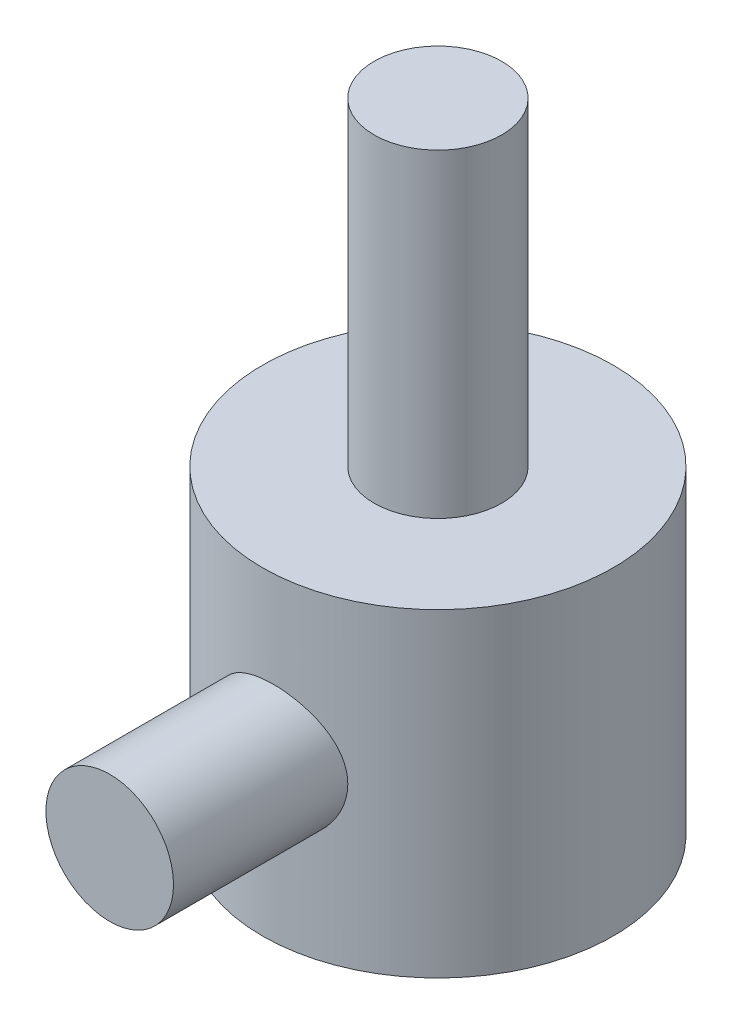
ISO-10303-21;
HEADER;
FILE_DESCRIPTION(('STEP AP214'),'2;1');
FILE_NAME('part.step','',(''),(''),'','','');
FILE_SCHEMA(('AUTOMOTIVE_DESIGN { 1 0 10303 214 1 1 1 1 }'));
ENDSEC;
DATA;
#1=APPLICATION_CONTEXT('core data for automotive mechanical design processes');
#2=APPLICATION_PROTOCOL_DEFINITION('international standard','automotive_design',2000,#1);
#3=PRODUCT_CONTEXT('',#1,'mechanical');
#4=PRODUCT('Part','Part','',(#3));
#5=PRODUCT_RELATED_PRODUCT_CATEGORY('part','',(#4));
#6=PRODUCT_DEFINITION_FORMATION('','',#4);
#7=PRODUCT_DEFINITION_CONTEXT('part definition',#1,'design');
#8=PRODUCT_DEFINITION('design','',#6,#7);
#9=PRODUCT_DEFINITION_SHAPE('','',#8);
#10=(LENGTH_UNIT() NAMED_UNIT(*) SI_UNIT(.MILLI.,.METRE.));
#11=(NAMED_UNIT(*) PLANE_ANGLE_UNIT() SI_UNIT($,.RADIAN.));
#12=(NAMED_UNIT(*) SI_UNIT($,.STERADIAN.) SOLID_ANGLE_UNIT());
#13=UNCERTAINTY_MEASURE_WITH_UNIT(LENGTH_MEASURE(1.E-05),#10,'distance_accuracy_value','');
#14=(GEOMETRIC_REPRESENTATION_CONTEXT(3) GLOBAL_UNCERTAINTY_ASSIGNED_CONTEXT((#13)) GLOBAL_UNIT_ASSIGNED_CONTEXT((#10,
#11,#12)) REPRESENTATION_CONTEXT('',''));
#15=CARTESIAN_POINT('',(0.,0.,0.));
#16=DIRECTION('',(0.,0.,1.));
#17=DIRECTION('',(1.,0.,0.));
#18=AXIS2_PLACEMENT_3D('',#15,#16,#17);
#19=CARTESIAN_POINT('',(0.,100.,0.));
#20=DIRECTION('',(0.,-1.,0.));
#21=DIRECTION('',(0.,0.,-1.));
#22=AXIS2_PLACEMENT_3D('',#19,#20,#21);
#23=CYLINDRICAL_SURFACE('',#22,55.);
#24=CARTESIAN_POINT('',(22.1157216143475,50.,50.3576693014746));
#25=CARTESIAN_POINT('',(22.1157236838797,49.4642124105563,50.3576674020005));
#26=CARTESIAN_POINT('',(22.0941726422844,48.9284527153607,50.3671492687955));
#27=CARTESIAN_POINT('',(22.0082229835859,47.8610714714432,50.4047649735963));
#28=CARTESIAN_POINT('',(21.9438272089872,47.3294496505638,50.4328975742316));
#29=CARTESIAN_POINT('',(21.7729003042168,46.2742760452371,50.5069247732102));
#30=CARTESIAN_POINT('',(21.6663673401147,45.7507246130665,50.552820144638));
#31=CARTESIAN_POINT('',(21.4122807529056,44.7154055414696,50.660963889444));
#32=CARTESIAN_POINT('',(21.2647260590152,44.2036382100193,50.7232126896908));
#33=CARTESIAN_POINT('',(20.93049383175,43.1966926019933,50.8620392855023));
#34=CARTESIAN_POINT('',(20.7439272920014,42.7014717877527,50.9385763642552));
#35=CARTESIAN_POINT('',(20.3330473412654,41.729108970846,51.1039743436858));
#36=CARTESIAN_POINT('',(20.1087342177927,41.2519668305092,51.1928351504931));
#37=CARTESIAN_POINT('',(19.6240888093337,40.3183822663139,51.3805667356155));
#38=CARTESIAN_POINT('',(19.3637544222514,39.8619410525668,51.4794380980269));
#39=CARTESIAN_POINT('',(18.808783755485,38.9719994721132,51.6847869466886));
#40=CARTESIAN_POINT('',(18.5141350050662,38.538507529546,51.7912671927391));
#41=CARTESIAN_POINT('',(17.8765801758587,37.6753213287226,52.0148796726526));
#42=CARTESIAN_POINT('',(17.5319799671762,37.2469466508307,52.1322782096817));
#43=CARTESIAN_POINT('',(16.8091288954211,36.4204113355761,52.3698186213808));
#44=CARTESIAN_POINT('',(16.4308769569539,36.0222516645361,52.48996058363));
#45=CARTESIAN_POINT('',(15.6427420098901,35.2581861832578,52.7302036742049));
#46=CARTESIAN_POINT('',(15.2328454949134,34.8922942897263,52.8503047628728));
#47=CARTESIAN_POINT('',(14.3839889867242,34.1952177650543,53.087616282059));
#48=CARTESIAN_POINT('',(13.9450386490618,33.8640216969062,53.2048276553287));
#49=CARTESIAN_POINT('',(13.0191272960243,33.2236101059816,53.4391324526118));
#50=CARTESIAN_POINT('',(12.5308800438819,32.9161544040873,53.5559624351806));
#51=CARTESIAN_POINT('',(11.5280579103023,32.3438045350466,53.7807391375584));
#52=CARTESIAN_POINT('',(11.0134820421372,32.0789119645983,53.8886855240372));
#53=CARTESIAN_POINT('',(9.96149221299141,31.5940434426413,54.093027998386));
#54=CARTESIAN_POINT('',(9.4240830587943,31.3740580934693,54.1894265011152));
#55=CARTESIAN_POINT('',(8.33010813566391,30.9810845225561,54.3683401258764));
#56=CARTESIAN_POINT('',(7.77354338400982,30.8080938094385,54.4508559837955));
#57=CARTESIAN_POINT('',(6.66655292784668,30.5165409313966,54.5972254774214));
#58=CARTESIAN_POINT('',(6.11667688237308,30.3961842245254,54.6616619272911));
#59=CARTESIAN_POINT('',(5.00711905138647,30.2020965973656,54.7744434677143));
#60=CARTESIAN_POINT('',(4.44743746627115,30.1283647253363,54.8227888867203));
#61=CARTESIAN_POINT('',(3.32281812503466,30.0284826995082,54.9024275776111));
#62=CARTESIAN_POINT('',(2.75788214019345,30.0023170563872,54.9337263981723));
#63=CARTESIAN_POINT('',(1.62713574394996,29.9979777593481,54.9788371155571));
#64=CARTESIAN_POINT('',(1.0613253688053,30.0198021661411,54.9926497189671));
#65=CARTESIAN_POINT('',(-0.0348315937860203,30.1087882222019,55.0025651929048));
#66=CARTESIAN_POINT('',(-0.565384191540226,30.1733330273857,54.9996197106104));
#67=CARTESIAN_POINT('',(-1.61931339885798,30.3446060209454,54.9786831333617));
#68=CARTESIAN_POINT('',(-2.14269031548288,30.4513323984238,54.9606926842662));
#69=CARTESIAN_POINT('',(-3.17858132938641,30.7060925253914,54.9105231469778));
#70=CARTESIAN_POINT('',(-3.69109546826779,30.8541261166498,54.8783441131352));
#71=CARTESIAN_POINT('',(-4.70178901119587,31.1902899737653,54.8010043993189));
#72=CARTESIAN_POINT('',(-5.19996814533689,31.3784209940343,54.7558434750922));
#73=CARTESIAN_POINT('',(-6.179646619676,31.7936701689634,54.6539566742744));
#74=CARTESIAN_POINT('',(-6.66111380062976,32.0208589714683,54.5972098054725));
#75=CARTESIAN_POINT('',(-7.60343400585102,32.5122788100242,54.4739718873885));
#76=CARTESIAN_POINT('',(-8.06428713300254,32.7765096611722,54.407480886746));
#77=CARTESIAN_POINT('',(-8.96276913849415,33.3402171938171,54.2667081134858));
#78=CARTESIAN_POINT('',(-9.40039345308663,33.6397007644732,54.1924248183917));
#79=CARTESIAN_POINT('',(-10.2498808957884,34.2719280467464,54.0381933911985));
#80=CARTESIAN_POINT('',(-10.661742374429,34.6046738844481,53.958244897082));
#81=CARTESIAN_POINT('',(-11.4770259531445,35.3185473823067,53.7908865971499));
#82=CARTESIAN_POINT('',(-11.8790339596309,35.7012505788777,53.7033032372411));
#83=CARTESIAN_POINT('',(-12.6497616572723,36.4985936383672,53.5270011808123));
#84=CARTESIAN_POINT('',(-13.0184803110986,36.9132344957488,53.4382824490113));
#85=CARTESIAN_POINT('',(-13.7204363118421,37.7720107024972,53.2623751771372));
#86=CARTESIAN_POINT('',(-14.0536654126768,38.2161528678085,53.1751869966047));
#87=CARTESIAN_POINT('',(-14.682376356784,39.131144580473,53.0050366961945));
#88=CARTESIAN_POINT('',(-14.9778594104655,39.6019932707239,52.9220744408547));
#89=CARTESIAN_POINT('',(-15.5359570751637,40.5796536150053,52.7609755598733));
#90=CARTESIAN_POINT('',(-15.7975623754953,41.0870708225954,52.6830119769948));
#91=CARTESIAN_POINT('',(-16.276899739838,42.1236100384359,52.5368952650308));
#92=CARTESIAN_POINT('',(-16.4946308581228,42.6527325142566,52.4687423474274));
#93=CARTESIAN_POINT('',(-16.8842668222693,43.7288146829171,52.3446594178914));
#94=CARTESIAN_POINT('',(-17.0561856507013,44.2757688759254,52.2887256774315));
#95=CARTESIAN_POINT('',(-17.3526546848794,45.3836080250294,52.191089151942));
#96=CARTESIAN_POINT('',(-17.4772071551389,45.9444923137822,52.1493856865945));
#97=CARTESIAN_POINT('',(-17.6738350478183,47.0540558401939,52.0830672686161));
#98=CARTESIAN_POINT('',(-17.7477444543932,47.6023748750782,52.0578567941032));
#99=CARTESIAN_POINT('',(-17.8498873953517,48.703741207238,52.0229224435107));
#100=CARTESIAN_POINT('',(-17.8781220570073,49.2567883874823,52.0131981852249));
#101=CARTESIAN_POINT('',(-17.888630231753,50.3632703620991,52.0095850438134));
#102=CARTESIAN_POINT('',(-17.8709119024354,50.9167050702408,52.0156933500848));
#103=CARTESIAN_POINT('',(-17.7897107703952,52.0198027381404,52.0435205169274));
#104=CARTESIAN_POINT('',(-17.7262286926641,52.5694657575103,52.0652391301994));
#105=CARTESIAN_POINT('',(-17.5572736087638,53.64096757415,52.1224495879569));
#106=CARTESIAN_POINT('',(-17.4534147827819,54.1630904727057,52.1574107837548));
#107=CARTESIAN_POINT('',(-17.2047191902253,55.1964386325998,52.2399730413166));
#108=CARTESIAN_POINT('',(-17.059883611254,55.7076642093067,52.2875737367554));
#109=CARTESIAN_POINT('',(-16.7304138133418,56.7159921648381,52.3939231953608));
#110=CARTESIAN_POINT('',(-16.5457743399442,57.2130926692164,52.4526734302399));
#111=CARTESIAN_POINT('',(-16.138126823531,58.1900676691349,52.579524512764));
#112=CARTESIAN_POINT('',(-15.9151175523448,58.6699416126794,52.6476256597062));
#113=CARTESIAN_POINT('',(-15.4253734802736,59.6231642770292,52.7932282472047));
#114=CARTESIAN_POINT('',(-15.157566586028,60.0959295072615,52.8709435348481));
#115=CARTESIAN_POINT('',(-14.5848726163191,61.0174622752617,53.0317821632953));
#116=CARTESIAN_POINT('',(-14.2799850164188,61.4662294734933,53.1149055805791));
#117=CARTESIAN_POINT('',(-13.6349971961724,62.3372856317674,53.2841252800937));
#118=CARTESIAN_POINT('',(-13.2948879317643,62.7595677461716,53.3702223220772));
#119=CARTESIAN_POINT('',(-12.5815713443992,63.5750901547493,53.5428678743474));
#120=CARTESIAN_POINT('',(-12.2083633928435,63.9683298971,53.6294163931791));
#121=CARTESIAN_POINT('',(-11.4132656798629,64.7406751741514,53.804372356091));
#122=CARTESIAN_POINT('',(-10.9899317790398,65.1183175367539,53.8926844851238));
#123=CARTESIAN_POINT('',(-10.1120838442276,65.8367444498813,54.0642742374828));
#124=CARTESIAN_POINT('',(-9.65756877888791,66.1775277802927,54.1475516941104));
#125=CARTESIAN_POINT('',(-8.72027692491515,66.8197456521615,54.306377637248));
#126=CARTESIAN_POINT('',(-8.23750141131728,67.1211819668712,54.3819264720307));
#127=CARTESIAN_POINT('',(-7.24686752093596,67.6823631231853,54.5227764510941));
#128=CARTESIAN_POINT('',(-6.73900981761729,67.9421090833938,54.5880778703248));
#129=CARTESIAN_POINT('',(-5.70806646261089,68.4148302225276,54.7054275789395));
#130=CARTESIAN_POINT('',(-5.18524227920746,68.628337487516,54.7576278783166));
#131=CARTESIAN_POINT('',(-4.12230323423413,69.0106819449892,54.8478902150556));
#132=CARTESIAN_POINT('',(-3.58218842674597,69.1795192771776,54.8859522966345));
#133=CARTESIAN_POINT('',(-2.48893947630912,69.4709273969987,54.9463808572816));
#134=CARTESIAN_POINT('',(-1.93580970354854,69.5935134859234,54.9687525293132));
#135=CARTESIAN_POINT('',(-0.820737347897336,69.7913566020687,54.996703175466));
#136=CARTESIAN_POINT('',(-0.258795158769104,69.8666157378434,55.0022828977596));
#137=CARTESIAN_POINT('',(0.840733953954625,69.9665606024259,54.9961814421687));
#138=CARTESIAN_POINT('',(1.37811174216207,69.9936162662308,54.9853607834286));
#139=CARTESIAN_POINT('',(2.45273553189503,70.0043777195021,54.9479126562596));
#140=CARTESIAN_POINT('',(2.98998153756597,69.9880851152285,54.9212857735552));
#141=CARTESIAN_POINT('',(4.06039542751218,69.912461404884,54.852537083576));
#142=CARTESIAN_POINT('',(4.59356354196914,69.8531327464277,54.8104161575703));
#143=CARTESIAN_POINT('',(5.65207281593722,69.6921511823137,54.7113941617541));
#144=CARTESIAN_POINT('',(6.17741390830692,69.5904979138051,54.6544929652334));
#145=CARTESIAN_POINT('',(7.21118656388141,69.3472280428715,54.5276731939803));
#146=CARTESIAN_POINT('',(7.71973822026917,69.2060455960028,54.4578987005322));
#147=CARTESIAN_POINT('',(8.72246780910055,68.8845998674896,54.3063135242963));
#148=CARTESIAN_POINT('',(9.21664593367475,68.704337108503,54.2245030024824));
#149=CARTESIAN_POINT('',(10.1877936078627,68.306204402309,54.05046052175));
#150=CARTESIAN_POINT('',(10.6647603218551,68.088328292104,53.9582268558422));
#151=CARTESIAN_POINT('',(11.5987661893442,67.6166289616875,53.7651939368931));
#152=CARTESIAN_POINT('',(12.0558045778057,67.3628043630237,53.6643943554494));
#153=CARTESIAN_POINT('',(12.9698578353422,66.8073745708645,53.4510421807358));
#154=CARTESIAN_POINT('',(13.4257286915697,66.5040147911365,53.3381539270174));
#155=CARTESIAN_POINT('',(14.310320266117,65.8616075499586,53.1076613416918));
#156=CARTESIAN_POINT('',(14.7390401969294,65.5225590541231,52.9900568734533));
#157=CARTESIAN_POINT('',(15.5671434822059,64.8107215216559,52.7527217492366));
#158=CARTESIAN_POINT('',(15.9665159483396,64.4379200755554,52.6329903243811));
#159=CARTESIAN_POINT('',(16.7335378938944,63.6608024885617,52.3941798685208));
#160=CARTESIAN_POINT('',(17.1011869054642,63.2564858830565,52.2751008471618));
#161=CARTESIAN_POINT('',(17.820239043646,62.3974750199208,52.0345073198007));
#162=CARTESIAN_POINT('',(18.169900761539,61.9412708132609,51.9131705244567));
#163=CARTESIAN_POINT('',(18.8294413001029,60.9991913894513,51.6776045812947));
#164=CARTESIAN_POINT('',(19.1393187375245,60.5133151415084,51.5633756806805));
#165=CARTESIAN_POINT('',(19.7168521176167,59.5148709171584,51.345311933783));
#166=CARTESIAN_POINT('',(19.9845103573081,59.0023043949094,51.2414765221334));
#167=CARTESIAN_POINT('',(20.4752551595126,57.953776053982,51.0473663412372));
#168=CARTESIAN_POINT('',(20.6983427628115,57.4178147819597,50.9570912553505));
#169=CARTESIAN_POINT('',(21.097686144716,56.3263440791087,50.7930535481894));
#170=CARTESIAN_POINT('',(21.2739499685265,55.7708380250396,50.7192880905941));
#171=CARTESIAN_POINT('',(21.577715295563,54.6444608154459,50.5908041219786));
#172=CARTESIAN_POINT('',(21.705216494131,54.0735895639468,50.5360857299603));
#173=CARTESIAN_POINT('',(21.9098180194442,52.9216043313233,50.4477187355886));
#174=CARTESIAN_POINT('',(21.9869476531661,52.3404965084941,50.4140578821056));
#175=CARTESIAN_POINT('',(22.0898961157888,51.1729143411932,50.3690351616351));
#176=CARTESIAN_POINT('',(22.1157193491637,50.5864404617213,50.3576713805233));
#177=CARTESIAN_POINT('',(22.1157216143475,50.,50.3576693014746));
#178=B_SPLINE_CURVE_WITH_KNOTS('',3,(#24,#25,#26,#27,#28,#29,#30,#31,#32,#33,#34,#35,#36,#37,
#38,#39,#40,#41,#42,#43,#44,#45,#46,#47,#48,#49,#50,#51,#52,#53,#54,#55,#56,#57,#58,#59,#60,#61,
#62,#63,#64,#65,#66,#67,#68,#69,#70,#71,#72,#73,#74,#75,#76,#77,#78,#79,#80,#81,#82,#83,#84,#85,
#86,#87,#88,#89,#90,#91,#92,#93,#94,#95,#96,#97,#98,#99,#100,#101,#102,#103,#104,#105,#106,#107,
#108,#109,#110,#111,#112,#113,#114,#115,#116,#117,#118,#119,#120,#121,#122,#123,#124,#125,#126,
#127,#128,#129,#130,#131,#132,#133,#134,#135,#136,#137,#138,#139,#140,#141,#142,#143,#144,#145,
#146,#147,#148,#149,#150,#151,#152,#153,#154,#155,#156,#157,#158,#159,#160,#161,#162,#163,#164,
#165,#166,#167,#168,#169,#170,#171,#172,#173,#174,#175,#176,#177),.UNSPECIFIED.,.T.,.F.,(4,2,2,
2,2,2,2,2,2,2,2,2,2,2,2,2,2,2,2,2,2,2,2,2,2,2,2,2,2,2,2,2,2,2,2,2,2,2,2,2,2,2,2,2,2,2,2,2,2,2,2,
2,2,2,2,2,2,2,2,2,2,2,2,2,2,2,2,2,2,2,2,2,2,2,2,2,4),(0.,1.60680095576918,3.21349532005291,
4.82025961994553,6.42706586487654,8.02936127396483,9.63164447896399,11.2340212280071,
12.8369821506108,14.5216401772934,16.2063520592651,17.8917870197688,19.5766646396573,
21.340576712541,23.1045549407468,24.8681636447271,26.631678834395,28.3292008612817,
30.0266882359649,31.723622746933,33.4204886856503,35.0219921796738,36.6234269269965,
38.2248555399648,39.8263142856216,41.4307008331604,43.0350793723675,44.6397719646906,
46.2445671927197,47.9283808501759,49.6122469588121,51.2965034680813,52.9807059544446,
54.70711678374,56.4335648225565,58.1594853194642,59.8853232923631,61.5447874932544,
63.2042107372406,64.8633394199458,66.5224418192285,68.1210959733764,69.7197037994892,
71.3185227849603,72.9173929562066,74.5621952341499,76.2070207774346,77.8522697238583,
79.4975499229739,81.2178866575889,82.9382803216456,84.6585964259141,86.3788663642329,
88.0781429199463,89.7774141611694,91.4761227387715,93.1747556285761,94.7872948819011,
96.3997743837863,98.0121621853688,99.6245638103106,101.219907574411,102.815230003789,
104.410814077394,106.006459350569,107.681895293352,109.357379809598,111.033482848512,
112.709610602043,114.469860262726,116.23017110851,117.990386147962,119.750560079159,
121.510431383511,123.270313682964,125.029171140575,126.787877599927),.UNSPECIFIED.);
#179=CARTESIAN_POINT('',(22.1157216143475,50.,50.3576693014746));
#180=VERTEX_POINT('',#179);
#181=EDGE_CURVE('E35',#180,#180,#178,.T.);
#182=ORIENTED_EDGE('',*,*,#181,.T.);
#183=EDGE_LOOP('',(#182));
#184=FACE_BOUND('',#183,.T.);
#185=CARTESIAN_POINT('',(0.,100.,0.));
#186=DIRECTION('',(0.,1.,0.));
#187=DIRECTION('',(0.,0.,1.));
#188=AXIS2_PLACEMENT_3D('',#185,#186,#187);
#189=CIRCLE('',#188,55.);
#190=CARTESIAN_POINT('',(0.,100.,55.));
#191=VERTEX_POINT('',#190);
#192=EDGE_CURVE('E43',#191,#191,#189,.T.);
#193=ORIENTED_EDGE('',*,*,#192,.F.);
#194=EDGE_LOOP('',(#193));
#195=FACE_BOUND('',#194,.T.);
#196=CARTESIAN_POINT('',(0.,0.,0.));
#197=DIRECTION('',(0.,1.,0.));
#198=DIRECTION('',(0.,0.,1.));
#199=AXIS2_PLACEMENT_3D('',#196,#197,#198);
#200=CIRCLE('',#199,55.);
#201=CARTESIAN_POINT('',(0.,0.,55.));
#202=VERTEX_POINT('',#201);
#203=EDGE_CURVE('E48',#202,#202,#200,.T.);
#204=ORIENTED_EDGE('',*,*,#203,.T.);
#205=EDGE_LOOP('',(#204));
#206=FACE_BOUND('',#205,.T.);
#207=ADVANCED_FACE('F31',(#184,#195,#206),#23,.T.);
#208=CARTESIAN_POINT('',(0.,100.,0.));
#209=DIRECTION('',(0.,1.,0.));
#210=DIRECTION('',(0.,0.,1.));
#211=AXIS2_PLACEMENT_3D('',#208,#209,#210);
#212=PLANE('',#211);
#213=CARTESIAN_POINT('',(0.,100.,0.));
#214=DIRECTION('',(0.,1.,0.));
#215=DIRECTION('',(0.,0.,1.));
#216=AXIS2_PLACEMENT_3D('',#213,#214,#215);
#217=CIRCLE('',#216,20.);
#218=CARTESIAN_POINT('',(0.,100.,20.));
#219=VERTEX_POINT('',#218);
#220=EDGE_CURVE('E10',#219,#219,#217,.T.);
#221=ORIENTED_EDGE('',*,*,#220,.F.);
#222=EDGE_LOOP('',(#221));
#223=FACE_BOUND('',#222,.T.);
#224=ORIENTED_EDGE('',*,*,#192,.T.);
#225=EDGE_LOOP('',(#224));
#226=FACE_BOUND('',#225,.T.);
#227=ADVANCED_FACE('F81',(#223,#226),#212,.T.);
#228=CARTESIAN_POINT('',(0.,0.,0.));
#229=DIRECTION('',(0.,1.,0.));
#230=DIRECTION('',(0.,0.,1.));
#231=AXIS2_PLACEMENT_3D('',#228,#229,#230);
#232=PLANE('',#231);
#233=ORIENTED_EDGE('',*,*,#203,.F.);
#234=EDGE_LOOP('',(#233));
#235=FACE_BOUND('',#234,.T.);
#236=ADVANCED_FACE('F85',(#235),#232,.F.);
#237=CARTESIAN_POINT('',(0.,200.,0.));
#238=DIRECTION('',(0.,-1.,0.));
#239=DIRECTION('',(0.,0.,-1.));
#240=AXIS2_PLACEMENT_3D('',#237,#238,#239);
#241=CYLINDRICAL_SURFACE('',#240,20.);
#242=CARTESIAN_POINT('',(0.,200.,0.));
#243=DIRECTION('',(0.,1.,0.));
#244=DIRECTION('',(0.,0.,1.));
#245=AXIS2_PLACEMENT_3D('',#242,#243,#244);
#246=CIRCLE('',#245,20.);
#247=CARTESIAN_POINT('',(0.,200.,20.));
#248=VERTEX_POINT('',#247);
#249=EDGE_CURVE('E51',#248,#248,#246,.T.);
#250=ORIENTED_EDGE('',*,*,#249,.F.);
#251=EDGE_LOOP('',(#250));
#252=FACE_BOUND('',#251,.T.);
#253=ORIENTED_EDGE('',*,*,#220,.T.);
#254=EDGE_LOOP('',(#253));
#255=FACE_BOUND('',#254,.T.);
#256=ADVANCED_FACE('F77',(#252,#255),#241,.T.);
#257=CARTESIAN_POINT('',(0.,200.,0.));
#258=DIRECTION('',(0.,1.,0.));
#259=DIRECTION('',(0.,0.,1.));
#260=AXIS2_PLACEMENT_3D('',#257,#258,#259);
#261=PLANE('',#260);
#262=ORIENTED_EDGE('',*,*,#249,.T.);
#263=EDGE_LOOP('',(#262));
#264=FACE_BOUND('',#263,.T.);
#265=ADVANCED_FACE('F71',(#264),#261,.T.);
#266=CARTESIAN_POINT('',(2.11572161434753,50.,35.));
#267=DIRECTION('',(0.,0.,1.));
#268=DIRECTION('',(1.,0.,0.));
#269=AXIS2_PLACEMENT_3D('',#266,#267,#268);
#270=CYLINDRICAL_SURFACE('',#269,20.);
#271=CARTESIAN_POINT('',(2.11572161434753,50.,105.));
#272=DIRECTION('',(0.,0.,1.));
#273=DIRECTION('',(1.,0.,0.));
#274=AXIS2_PLACEMENT_3D('',#271,#272,#273);
#275=CIRCLE('',#274,20.);
#276=CARTESIAN_POINT('',(22.1157216143475,50.,105.));
#277=VERTEX_POINT('',#276);
#278=EDGE_CURVE('E60',#277,#277,#275,.T.);
#279=ORIENTED_EDGE('',*,*,#278,.F.);
#280=EDGE_LOOP('',(#279));
#281=FACE_BOUND('',#280,.T.);
#282=ORIENTED_EDGE('',*,*,#181,.F.);
#283=EDGE_LOOP('',(#282));
#284=FACE_BOUND('',#283,.T.);
#285=ADVANCED_FACE('F68',(#281,#284),#270,.T.);
#286=CARTESIAN_POINT('',(2.11572161434753,50.,105.));
#287=DIRECTION('',(0.,0.,1.));
#288=DIRECTION('',(1.,0.,0.));
#289=AXIS2_PLACEMENT_3D('',#286,#287,#288);
#290=PLANE('',#289);
#291=ORIENTED_EDGE('',*,*,#278,.T.);
#292=EDGE_LOOP('',(#291));
#293=FACE_BOUND('',#292,.T.);
#294=ADVANCED_FACE('F66',(#293),#290,.T.);
#295=CLOSED_SHELL('',(#207,#227,#236,#256,#265,#285,#294));
#296=MANIFOLD_SOLID_BREP('B2',#295);
#297=ADVANCED_BREP_SHAPE_REPRESENTATION('',(#18,#296),#14);
#298=SHAPE_DEFINITION_REPRESENTATION(#9,#297);
ENDSEC;
END-ISO-10303-21;
